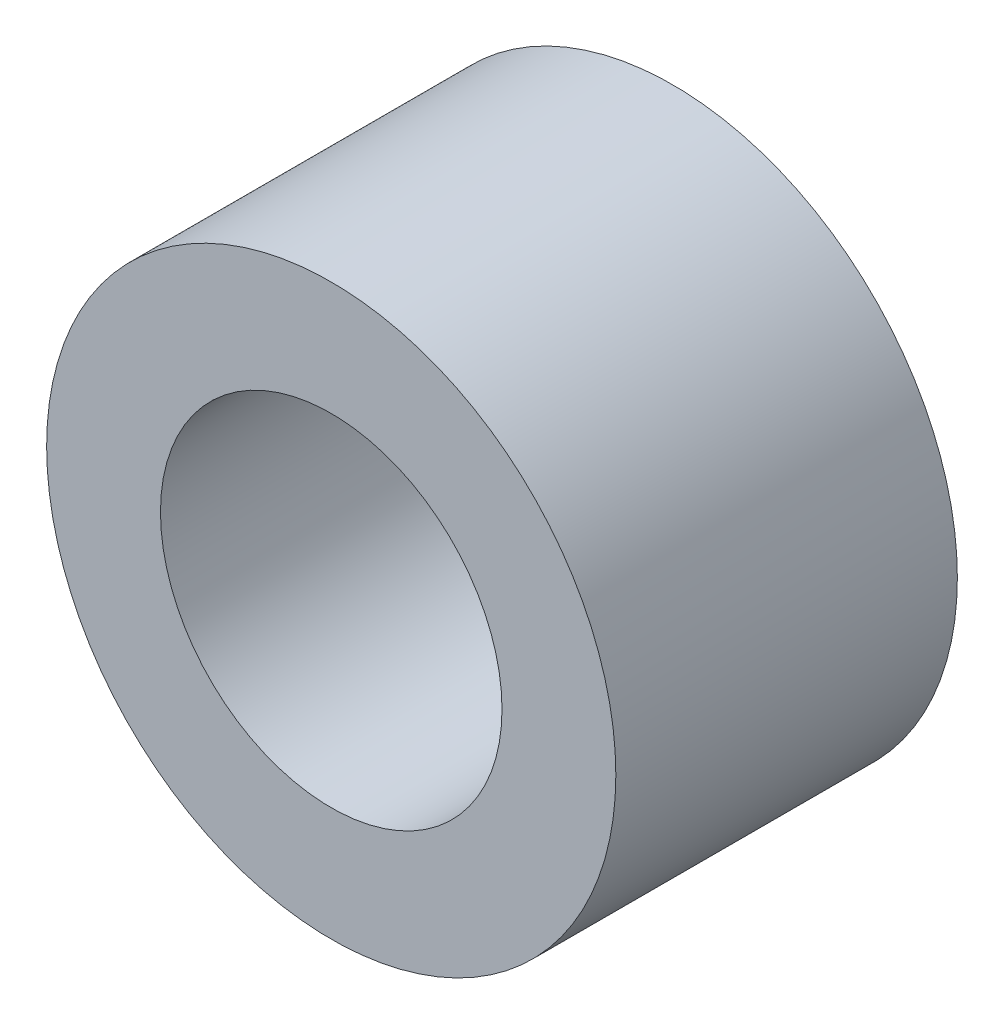
ISO-10303-21;
HEADER;
FILE_DESCRIPTION(('STEP AP214'),'2;1');
FILE_NAME('part.step','',(''),(''),'','','');
FILE_SCHEMA(('AUTOMOTIVE_DESIGN { 1 0 10303 214 1 1 1 1 }'));
ENDSEC;
DATA;
#1=APPLICATION_CONTEXT('core data for automotive mechanical design processes');
#2=APPLICATION_PROTOCOL_DEFINITION('international standard','automotive_design',2000,#1);
#3=PRODUCT_CONTEXT('',#1,'mechanical');
#4=PRODUCT('Part','Part','',(#3));
#5=PRODUCT_RELATED_PRODUCT_CATEGORY('part','',(#4));
#6=PRODUCT_DEFINITION_FORMATION('','',#4);
#7=PRODUCT_DEFINITION_CONTEXT('part definition',#1,'design');
#8=PRODUCT_DEFINITION('design','',#6,#7);
#9=PRODUCT_DEFINITION_SHAPE('','',#8);
#10=(LENGTH_UNIT() NAMED_UNIT(*) SI_UNIT(.MILLI.,.METRE.));
#11=(NAMED_UNIT(*) PLANE_ANGLE_UNIT() SI_UNIT($,.RADIAN.));
#12=(NAMED_UNIT(*) SI_UNIT($,.STERADIAN.) SOLID_ANGLE_UNIT());
#13=UNCERTAINTY_MEASURE_WITH_UNIT(LENGTH_MEASURE(1.E-05),#10,'distance_accuracy_value','');
#14=(GEOMETRIC_REPRESENTATION_CONTEXT(3) GLOBAL_UNCERTAINTY_ASSIGNED_CONTEXT((#13)) GLOBAL_UNIT_ASSIGNED_CONTEXT((#10,
#11,#12)) REPRESENTATION_CONTEXT('',''));
#15=CARTESIAN_POINT('',(0.,0.,0.));
#16=DIRECTION('',(0.,0.,1.));
#17=DIRECTION('',(1.,0.,0.));
#18=AXIS2_PLACEMENT_3D('',#15,#16,#17);
#19=CARTESIAN_POINT('',(0.,0.,1.5));
#20=DIRECTION('',(0.,0.,1.));
#21=DIRECTION('',(1.,0.,0.));
#22=AXIS2_PLACEMENT_3D('',#19,#20,#21);
#23=PLANE('',#22);
#24=CARTESIAN_POINT('',(0.,0.,1.5));
#25=DIRECTION('',(0.,0.,1.));
#26=DIRECTION('',(1.,0.,0.));
#27=AXIS2_PLACEMENT_3D('',#24,#25,#26);
#28=CIRCLE('',#27,2.5);
#29=CARTESIAN_POINT('',(2.5,0.,1.5));
#30=VERTEX_POINT('',#29);
#31=EDGE_CURVE('E10',#30,#30,#28,.T.);
#32=ORIENTED_EDGE('',*,*,#31,.T.);
#33=EDGE_LOOP('',(#32));
#34=FACE_BOUND('',#33,.T.);
#35=CARTESIAN_POINT('',(0.,0.,1.5));
#36=DIRECTION('',(0.,0.,1.));
#37=DIRECTION('',(1.,0.,0.));
#38=AXIS2_PLACEMENT_3D('',#35,#36,#37);
#39=CIRCLE('',#38,1.5);
#40=CARTESIAN_POINT('',(1.5,0.,1.5));
#41=VERTEX_POINT('',#40);
#42=EDGE_CURVE('E54',#41,#41,#39,.T.);
#43=ORIENTED_EDGE('',*,*,#42,.F.);
#44=EDGE_LOOP('',(#43));
#45=FACE_BOUND('',#44,.T.);
#46=ADVANCED_FACE('F41',(#34,#45),#23,.T.);
#47=CARTESIAN_POINT('',(0.,0.,-1.5));
#48=DIRECTION('',(0.,0.,1.));
#49=DIRECTION('',(1.,0.,0.));
#50=AXIS2_PLACEMENT_3D('',#47,#48,#49);
#51=PLANE('',#50);
#52=CARTESIAN_POINT('',(0.,0.,-1.5));
#53=DIRECTION('',(0.,0.,1.));
#54=DIRECTION('',(1.,0.,0.));
#55=AXIS2_PLACEMENT_3D('',#52,#53,#54);
#56=CIRCLE('',#55,2.5);
#57=CARTESIAN_POINT('',(2.5,0.,-1.5));
#58=VERTEX_POINT('',#57);
#59=EDGE_CURVE('E45',#58,#58,#56,.T.);
#60=ORIENTED_EDGE('',*,*,#59,.F.);
#61=EDGE_LOOP('',(#60));
#62=FACE_BOUND('',#61,.T.);
#63=CARTESIAN_POINT('',(0.,0.,-1.5));
#64=DIRECTION('',(0.,0.,1.));
#65=DIRECTION('',(1.,0.,0.));
#66=AXIS2_PLACEMENT_3D('',#63,#64,#65);
#67=CIRCLE('',#66,1.5);
#68=CARTESIAN_POINT('',(1.5,0.,-1.5));
#69=VERTEX_POINT('',#68);
#70=EDGE_CURVE('E56',#69,#69,#67,.T.);
#71=ORIENTED_EDGE('',*,*,#70,.T.);
#72=EDGE_LOOP('',(#71));
#73=FACE_BOUND('',#72,.T.);
#74=ADVANCED_FACE('F68',(#62,#73),#51,.F.);
#75=CARTESIAN_POINT('',(0.,0.,1.5));
#76=DIRECTION('',(0.,0.,-1.));
#77=DIRECTION('',(-1.,0.,0.));
#78=AXIS2_PLACEMENT_3D('',#75,#76,#77);
#79=CYLINDRICAL_SURFACE('',#78,2.5);
#80=ORIENTED_EDGE('',*,*,#31,.F.);
#81=EDGE_LOOP('',(#80));
#82=FACE_BOUND('',#81,.T.);
#83=ORIENTED_EDGE('',*,*,#59,.T.);
#84=EDGE_LOOP('',(#83));
#85=FACE_BOUND('',#84,.T.);
#86=ADVANCED_FACE('F43',(#82,#85),#79,.T.);
#87=CARTESIAN_POINT('',(0.,0.,1.5));
#88=DIRECTION('',(0.,0.,-1.));
#89=DIRECTION('',(-1.,0.,0.));
#90=AXIS2_PLACEMENT_3D('',#87,#88,#89);
#91=CYLINDRICAL_SURFACE('',#90,1.5);
#92=ORIENTED_EDGE('',*,*,#42,.T.);
#93=EDGE_LOOP('',(#92));
#94=FACE_BOUND('',#93,.T.);
#95=ORIENTED_EDGE('',*,*,#70,.F.);
#96=EDGE_LOOP('',(#95));
#97=FACE_BOUND('',#96,.T.);
#98=ADVANCED_FACE('F64',(#94,#97),#91,.F.);
#99=CLOSED_SHELL('',(#46,#74,#86,#98));
#100=MANIFOLD_SOLID_BREP('B2',#99);
#101=ADVANCED_BREP_SHAPE_REPRESENTATION('',(#18,#100),#14);
#102=SHAPE_DEFINITION_REPRESENTATION(#9,#101);
ENDSEC;
END-ISO-10303-21;
